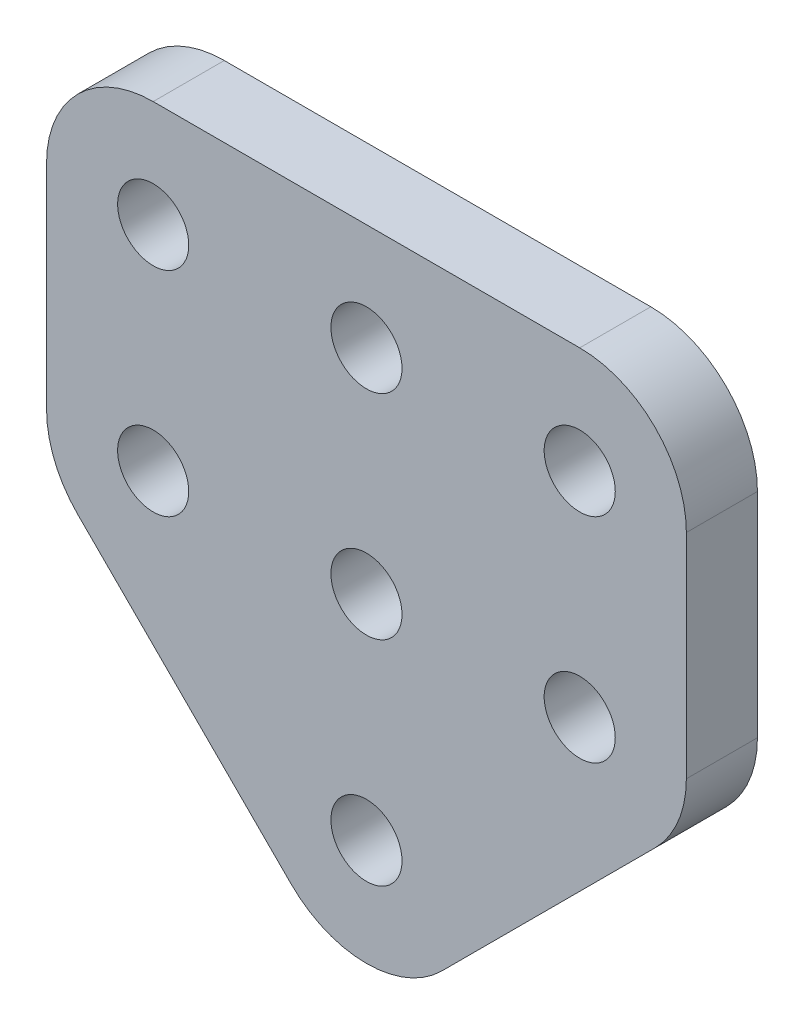
ISO-10303-21;
HEADER;
FILE_DESCRIPTION(('STEP AP214'),'2;1');
FILE_NAME('part.step','',(''),(''),'','','');
FILE_SCHEMA(('AUTOMOTIVE_DESIGN { 1 0 10303 214 1 1 1 1 }'));
ENDSEC;
DATA;
#1=APPLICATION_CONTEXT('core data for automotive mechanical design processes');
#2=APPLICATION_PROTOCOL_DEFINITION('international standard','automotive_design',2000,#1);
#3=PRODUCT_CONTEXT('',#1,'mechanical');
#4=PRODUCT('Part','Part','',(#3));
#5=PRODUCT_RELATED_PRODUCT_CATEGORY('part','',(#4));
#6=PRODUCT_DEFINITION_FORMATION('','',#4);
#7=PRODUCT_DEFINITION_CONTEXT('part definition',#1,'design');
#8=PRODUCT_DEFINITION('design','',#6,#7);
#9=PRODUCT_DEFINITION_SHAPE('','',#8);
#10=(LENGTH_UNIT() NAMED_UNIT(*) SI_UNIT(.MILLI.,.METRE.));
#11=(NAMED_UNIT(*) PLANE_ANGLE_UNIT() SI_UNIT($,.RADIAN.));
#12=(NAMED_UNIT(*) SI_UNIT($,.STERADIAN.) SOLID_ANGLE_UNIT());
#13=UNCERTAINTY_MEASURE_WITH_UNIT(LENGTH_MEASURE(1.E-05),#10,'distance_accuracy_value','');
#14=(GEOMETRIC_REPRESENTATION_CONTEXT(3) GLOBAL_UNCERTAINTY_ASSIGNED_CONTEXT((#13)) GLOBAL_UNIT_ASSIGNED_CONTEXT((#10,
#11,#12)) REPRESENTATION_CONTEXT('',''));
#15=CARTESIAN_POINT('',(0.,0.,0.));
#16=DIRECTION('',(0.,0.,1.));
#17=DIRECTION('',(1.,0.,0.));
#18=AXIS2_PLACEMENT_3D('',#15,#16,#17);
#19=CARTESIAN_POINT('',(187.7270545748,195.1787200631,3.));
#20=DIRECTION('',(0.,0.,1.));
#21=DIRECTION('',(1.,0.,0.));
#22=AXIS2_PLACEMENT_3D('',#19,#20,#21);
#23=PLANE('',#22);
#24=CARTESIAN_POINT('',(187.7270545748,195.1787200631,3.));
#25=DIRECTION('',(0.,0.,1.));
#26=DIRECTION('',(1.,0.,0.));
#27=AXIS2_PLACEMENT_3D('',#24,#25,#26);
#28=CIRCLE('',#27,1.5);
#29=CARTESIAN_POINT('',(189.2270545748,195.1787200631,3.));
#30=VERTEX_POINT('',#29);
#31=EDGE_CURVE('E236',#30,#30,#28,.T.);
#32=ORIENTED_EDGE('',*,*,#31,.F.);
#33=EDGE_LOOP('',(#32));
#34=FACE_BOUND('',#33,.T.);
#35=CARTESIAN_POINT('',(178.7270545748,213.1787200631,3.));
#36=DIRECTION('',(0.,0.,1.));
#37=DIRECTION('',(1.,0.,0.));
#38=AXIS2_PLACEMENT_3D('',#35,#36,#37);
#39=CIRCLE('',#38,1.5);
#40=CARTESIAN_POINT('',(180.2270545748,213.1787200631,3.));
#41=VERTEX_POINT('',#40);
#42=EDGE_CURVE('E224',#41,#41,#39,.T.);
#43=ORIENTED_EDGE('',*,*,#42,.F.);
#44=EDGE_LOOP('',(#43));
#45=FACE_BOUND('',#44,.T.);
#46=CARTESIAN_POINT('',(178.7270545748,204.1787200631,3.));
#47=DIRECTION('',(0.,0.,1.));
#48=DIRECTION('',(1.,0.,0.));
#49=AXIS2_PLACEMENT_3D('',#46,#47,#48);
#50=CIRCLE('',#49,1.5);
#51=CARTESIAN_POINT('',(180.2270545748,204.1787200631,3.));
#52=VERTEX_POINT('',#51);
#53=EDGE_CURVE('E212',#52,#52,#50,.T.);
#54=ORIENTED_EDGE('',*,*,#53,.F.);
#55=EDGE_LOOP('',(#54));
#56=FACE_BOUND('',#55,.T.);
#57=CARTESIAN_POINT('',(187.7270545748,195.1787200631,3.));
#58=DIRECTION('',(0.,0.,1.));
#59=DIRECTION('',(1.,0.,0.));
#60=AXIS2_PLACEMENT_3D('',#57,#58,#59);
#61=CIRCLE('',#60,4.50000000005025);
#62=CARTESIAN_POINT('',(184.5450740594,191.9967395477,3.));
#63=VERTEX_POINT('',#62);
#64=CARTESIAN_POINT('',(190.9090350901,191.9967395477,3.));
#65=VERTEX_POINT('',#64);
#66=EDGE_CURVE('E161',#63,#65,#61,.T.);
#67=ORIENTED_EDGE('',*,*,#66,.T.);
#68=DIRECTION('',(0.707106781186548,0.707106781186548,0.));
#69=VECTOR('',#68,1.);
#70=CARTESIAN_POINT('',(190.9090350901,191.9967395477,3.));
#71=LINE('',#70,#69);
#72=CARTESIAN_POINT('',(199.909035090095,200.996739547705,3.));
#73=VERTEX_POINT('',#72);
#74=EDGE_CURVE('E99',#65,#73,#71,.T.);
#75=ORIENTED_EDGE('',*,*,#74,.T.);
#76=CARTESIAN_POINT('',(196.7270545748,204.1787200631,3.));
#77=DIRECTION('',(0.,0.,1.));
#78=DIRECTION('',(1.,0.,0.));
#79=AXIS2_PLACEMENT_3D('',#76,#77,#78);
#80=CIRCLE('',#79,4.50000000000745);
#81=CARTESIAN_POINT('',(201.2270545748,204.1787200631,3.));
#82=VERTEX_POINT('',#81);
#83=EDGE_CURVE('E182',#73,#82,#80,.T.);
#84=ORIENTED_EDGE('',*,*,#83,.T.);
#85=DIRECTION('',(0.,1.,0.));
#86=VECTOR('',#85,1.);
#87=CARTESIAN_POINT('',(201.2270545748,213.1787200631,3.));
#88=LINE('',#87,#86);
#89=CARTESIAN_POINT('',(201.2270545748,213.1787200631,3.));
#90=VERTEX_POINT('',#89);
#91=EDGE_CURVE('E201',#82,#90,#88,.T.);
#92=ORIENTED_EDGE('',*,*,#91,.T.);
#93=CARTESIAN_POINT('',(196.7270545748,213.1787200631,3.));
#94=DIRECTION('',(0.,0.,1.));
#95=DIRECTION('',(1.,0.,0.));
#96=AXIS2_PLACEMENT_3D('',#93,#94,#95);
#97=CIRCLE('',#96,4.5);
#98=CARTESIAN_POINT('',(196.7270545748,217.6787200631,3.));
#99=VERTEX_POINT('',#98);
#100=EDGE_CURVE('E198',#90,#99,#97,.T.);
#101=ORIENTED_EDGE('',*,*,#100,.T.);
#102=DIRECTION('',(-1.,0.,0.));
#103=VECTOR('',#102,1.);
#104=CARTESIAN_POINT('',(196.7270545748,217.6787200631,3.));
#105=LINE('',#104,#103);
#106=CARTESIAN_POINT('',(178.7270545748,217.6787200631,3.));
#107=VERTEX_POINT('',#106);
#108=EDGE_CURVE('E200',#99,#107,#105,.T.);
#109=ORIENTED_EDGE('',*,*,#108,.T.);
#110=CARTESIAN_POINT('',(178.7270545748,213.1787200631,3.));
#111=DIRECTION('',(0.,0.,1.));
#112=DIRECTION('',(1.,0.,0.));
#113=AXIS2_PLACEMENT_3D('',#110,#111,#112);
#114=CIRCLE('',#113,4.5);
#115=CARTESIAN_POINT('',(174.2270545748,213.1787200631,3.));
#116=VERTEX_POINT('',#115);
#117=EDGE_CURVE('E124',#107,#116,#114,.T.);
#118=ORIENTED_EDGE('',*,*,#117,.T.);
#119=DIRECTION('',(0.,-1.,0.));
#120=VECTOR('',#119,1.);
#121=CARTESIAN_POINT('',(174.2270545748,213.1787200631,3.));
#122=LINE('',#121,#120);
#123=CARTESIAN_POINT('',(174.227054574757,204.1787200631,3.));
#124=VERTEX_POINT('',#123);
#125=EDGE_CURVE('E118',#116,#124,#122,.T.);
#126=ORIENTED_EDGE('',*,*,#125,.T.);
#127=CARTESIAN_POINT('',(178.7270545748,204.1787200631,3.));
#128=DIRECTION('',(0.,0.,1.));
#129=DIRECTION('',(1.,0.,0.));
#130=AXIS2_PLACEMENT_3D('',#127,#128,#129);
#131=CIRCLE('',#130,4.50000000004281);
#132=CARTESIAN_POINT('',(175.5450740594,200.9967395477,3.));
#133=VERTEX_POINT('',#132);
#134=EDGE_CURVE('E122',#124,#133,#131,.T.);
#135=ORIENTED_EDGE('',*,*,#134,.T.);
#136=DIRECTION('',(0.707106781186548,-0.707106781186548,0.));
#137=VECTOR('',#136,1.);
#138=CARTESIAN_POINT('',(184.5450740594,191.9967395477,3.));
#139=LINE('',#138,#137);
#140=EDGE_CURVE('E50',#133,#63,#139,.T.);
#141=ORIENTED_EDGE('',*,*,#140,.T.);
#142=EDGE_LOOP('',(#67,#75,#84,#92,#101,#109,#118,#126,#135,#141));
#143=FACE_BOUND('',#142,.T.);
#144=CARTESIAN_POINT('',(187.7270545748,204.1787200631,3.));
#145=DIRECTION('',(0.,0.,1.));
#146=DIRECTION('',(1.,0.,0.));
#147=AXIS2_PLACEMENT_3D('',#144,#145,#146);
#148=CIRCLE('',#147,1.5);
#149=CARTESIAN_POINT('',(189.2270545748,204.1787200631,3.));
#150=VERTEX_POINT('',#149);
#151=EDGE_CURVE('E146',#150,#150,#148,.T.);
#152=ORIENTED_EDGE('',*,*,#151,.F.);
#153=EDGE_LOOP('',(#152));
#154=FACE_BOUND('',#153,.T.);
#155=CARTESIAN_POINT('',(187.7270545748,213.1787200631,3.));
#156=DIRECTION('',(0.,0.,1.));
#157=DIRECTION('',(1.,0.,0.));
#158=AXIS2_PLACEMENT_3D('',#155,#156,#157);
#159=CIRCLE('',#158,1.5);
#160=CARTESIAN_POINT('',(189.2270545748,213.1787200631,3.));
#161=VERTEX_POINT('',#160);
#162=EDGE_CURVE('E218',#161,#161,#159,.T.);
#163=ORIENTED_EDGE('',*,*,#162,.F.);
#164=EDGE_LOOP('',(#163));
#165=FACE_BOUND('',#164,.T.);
#166=CARTESIAN_POINT('',(196.7270545748,213.1787200631,3.));
#167=DIRECTION('',(0.,0.,1.));
#168=DIRECTION('',(1.,0.,0.));
#169=AXIS2_PLACEMENT_3D('',#166,#167,#168);
#170=CIRCLE('',#169,1.5);
#171=CARTESIAN_POINT('',(198.2270545748,213.1787200631,3.));
#172=VERTEX_POINT('',#171);
#173=EDGE_CURVE('E230',#172,#172,#170,.T.);
#174=ORIENTED_EDGE('',*,*,#173,.F.);
#175=EDGE_LOOP('',(#174));
#176=FACE_BOUND('',#175,.T.);
#177=CARTESIAN_POINT('',(196.7270545748,204.1787200631,3.));
#178=DIRECTION('',(0.,0.,1.));
#179=DIRECTION('',(1.,0.,0.));
#180=AXIS2_PLACEMENT_3D('',#177,#178,#179);
#181=CIRCLE('',#180,1.5);
#182=CARTESIAN_POINT('',(198.2270545748,204.1787200631,3.));
#183=VERTEX_POINT('',#182);
#184=EDGE_CURVE('E242',#183,#183,#181,.T.);
#185=ORIENTED_EDGE('',*,*,#184,.F.);
#186=EDGE_LOOP('',(#185));
#187=FACE_BOUND('',#186,.T.);
#188=ADVANCED_FACE('F33',(#34,#45,#56,#143,#154,#165,#176,#187),#23,.T.);
#189=CARTESIAN_POINT('',(187.7270545748,195.1787200631,0.));
#190=DIRECTION('',(0.,0.,1.));
#191=DIRECTION('',(1.,0.,0.));
#192=AXIS2_PLACEMENT_3D('',#189,#190,#191);
#193=PLANE('',#192);
#194=CARTESIAN_POINT('',(187.7270545748,195.1787200631,0.));
#195=DIRECTION('',(0.,0.,1.));
#196=DIRECTION('',(1.,0.,0.));
#197=AXIS2_PLACEMENT_3D('',#194,#195,#196);
#198=CIRCLE('',#197,1.5);
#199=CARTESIAN_POINT('',(189.2270545748,195.1787200631,0.));
#200=VERTEX_POINT('',#199);
#201=EDGE_CURVE('E239',#200,#200,#198,.T.);
#202=ORIENTED_EDGE('',*,*,#201,.T.);
#203=EDGE_LOOP('',(#202));
#204=FACE_BOUND('',#203,.T.);
#205=CARTESIAN_POINT('',(178.7270545748,213.1787200631,0.));
#206=DIRECTION('',(0.,0.,1.));
#207=DIRECTION('',(1.,0.,0.));
#208=AXIS2_PLACEMENT_3D('',#205,#206,#207);
#209=CIRCLE('',#208,1.5);
#210=CARTESIAN_POINT('',(180.2270545748,213.1787200631,0.));
#211=VERTEX_POINT('',#210);
#212=EDGE_CURVE('E227',#211,#211,#209,.T.);
#213=ORIENTED_EDGE('',*,*,#212,.T.);
#214=EDGE_LOOP('',(#213));
#215=FACE_BOUND('',#214,.T.);
#216=CARTESIAN_POINT('',(178.7270545748,204.1787200631,0.));
#217=DIRECTION('',(0.,0.,1.));
#218=DIRECTION('',(1.,0.,0.));
#219=AXIS2_PLACEMENT_3D('',#216,#217,#218);
#220=CIRCLE('',#219,1.5);
#221=CARTESIAN_POINT('',(180.2270545748,204.1787200631,0.));
#222=VERTEX_POINT('',#221);
#223=EDGE_CURVE('E215',#222,#222,#220,.T.);
#224=ORIENTED_EDGE('',*,*,#223,.T.);
#225=EDGE_LOOP('',(#224));
#226=FACE_BOUND('',#225,.T.);
#227=CARTESIAN_POINT('',(187.7270545748,195.1787200631,0.));
#228=DIRECTION('',(0.,0.,1.));
#229=DIRECTION('',(1.,0.,0.));
#230=AXIS2_PLACEMENT_3D('',#227,#228,#229);
#231=CIRCLE('',#230,4.50000000005025);
#232=CARTESIAN_POINT('',(184.5450740594,191.9967395477,0.));
#233=VERTEX_POINT('',#232);
#234=CARTESIAN_POINT('',(190.9090350901,191.9967395477,0.));
#235=VERTEX_POINT('',#234);
#236=EDGE_CURVE('E142',#233,#235,#231,.T.);
#237=ORIENTED_EDGE('',*,*,#236,.F.);
#238=DIRECTION('',(0.707106781186548,-0.707106781186548,0.));
#239=VECTOR('',#238,1.);
#240=CARTESIAN_POINT('',(184.5450740594,191.9967395477,0.));
#241=LINE('',#240,#239);
#242=CARTESIAN_POINT('',(175.5450740594,200.9967395477,0.));
#243=VERTEX_POINT('',#242);
#244=EDGE_CURVE('E91',#243,#233,#241,.T.);
#245=ORIENTED_EDGE('',*,*,#244,.F.);
#246=CARTESIAN_POINT('',(178.7270545748,204.1787200631,0.));
#247=DIRECTION('',(0.,0.,1.));
#248=DIRECTION('',(1.,0.,0.));
#249=AXIS2_PLACEMENT_3D('',#246,#247,#248);
#250=CIRCLE('',#249,4.50000000004281);
#251=CARTESIAN_POINT('',(174.227054574757,204.1787200631,0.));
#252=VERTEX_POINT('',#251);
#253=EDGE_CURVE('E85',#252,#243,#250,.T.);
#254=ORIENTED_EDGE('',*,*,#253,.F.);
#255=DIRECTION('',(0.,-1.,0.));
#256=VECTOR('',#255,1.);
#257=CARTESIAN_POINT('',(174.2270545748,213.1787200631,0.));
#258=LINE('',#257,#256);
#259=CARTESIAN_POINT('',(174.2270545748,213.1787200631,0.));
#260=VERTEX_POINT('',#259);
#261=EDGE_CURVE('E132',#260,#252,#258,.T.);
#262=ORIENTED_EDGE('',*,*,#261,.F.);
#263=CARTESIAN_POINT('',(178.7270545748,213.1787200631,0.));
#264=DIRECTION('',(0.,0.,1.));
#265=DIRECTION('',(1.,0.,0.));
#266=AXIS2_PLACEMENT_3D('',#263,#264,#265);
#267=CIRCLE('',#266,4.5);
#268=CARTESIAN_POINT('',(178.7270545748,217.6787200631,0.));
#269=VERTEX_POINT('',#268);
#270=EDGE_CURVE('E156',#269,#260,#267,.T.);
#271=ORIENTED_EDGE('',*,*,#270,.F.);
#272=DIRECTION('',(-1.,0.,0.));
#273=VECTOR('',#272,1.);
#274=CARTESIAN_POINT('',(196.7270545748,217.6787200631,0.));
#275=LINE('',#274,#273);
#276=CARTESIAN_POINT('',(196.7270545748,217.6787200631,0.));
#277=VERTEX_POINT('',#276);
#278=EDGE_CURVE('E154',#277,#269,#275,.T.);
#279=ORIENTED_EDGE('',*,*,#278,.F.);
#280=CARTESIAN_POINT('',(196.7270545748,213.1787200631,0.));
#281=DIRECTION('',(0.,0.,1.));
#282=DIRECTION('',(1.,0.,0.));
#283=AXIS2_PLACEMENT_3D('',#280,#281,#282);
#284=CIRCLE('',#283,4.5);
#285=CARTESIAN_POINT('',(201.2270545748,213.1787200631,0.));
#286=VERTEX_POINT('',#285);
#287=EDGE_CURVE('E152',#286,#277,#284,.T.);
#288=ORIENTED_EDGE('',*,*,#287,.F.);
#289=DIRECTION('',(0.,1.,0.));
#290=VECTOR('',#289,1.);
#291=CARTESIAN_POINT('',(201.2270545748,213.1787200631,0.));
#292=LINE('',#291,#290);
#293=CARTESIAN_POINT('',(201.2270545748,204.1787200631,0.));
#294=VERTEX_POINT('',#293);
#295=EDGE_CURVE('E150',#294,#286,#292,.T.);
#296=ORIENTED_EDGE('',*,*,#295,.F.);
#297=CARTESIAN_POINT('',(196.7270545748,204.1787200631,0.));
#298=DIRECTION('',(0.,0.,1.));
#299=DIRECTION('',(1.,0.,0.));
#300=AXIS2_PLACEMENT_3D('',#297,#298,#299);
#301=CIRCLE('',#300,4.50000000000745);
#302=CARTESIAN_POINT('',(199.909035090095,200.996739547705,0.));
#303=VERTEX_POINT('',#302);
#304=EDGE_CURVE('E148',#303,#294,#301,.T.);
#305=ORIENTED_EDGE('',*,*,#304,.F.);
#306=DIRECTION('',(0.707106781186548,0.707106781186548,0.));
#307=VECTOR('',#306,1.);
#308=CARTESIAN_POINT('',(190.9090350901,191.9967395477,0.));
#309=LINE('',#308,#307);
#310=EDGE_CURVE('E145',#235,#303,#309,.T.);
#311=ORIENTED_EDGE('',*,*,#310,.F.);
#312=EDGE_LOOP('',(#237,#245,#254,#262,#271,#279,#288,#296,#305,#311));
#313=FACE_BOUND('',#312,.T.);
#314=CARTESIAN_POINT('',(187.7270545748,204.1787200631,0.));
#315=DIRECTION('',(0.,0.,1.));
#316=DIRECTION('',(1.,0.,0.));
#317=AXIS2_PLACEMENT_3D('',#314,#315,#316);
#318=CIRCLE('',#317,1.5);
#319=CARTESIAN_POINT('',(189.2270545748,204.1787200631,0.));
#320=VERTEX_POINT('',#319);
#321=EDGE_CURVE('E209',#320,#320,#318,.T.);
#322=ORIENTED_EDGE('',*,*,#321,.T.);
#323=EDGE_LOOP('',(#322));
#324=FACE_BOUND('',#323,.T.);
#325=CARTESIAN_POINT('',(187.7270545748,213.1787200631,0.));
#326=DIRECTION('',(0.,0.,1.));
#327=DIRECTION('',(1.,0.,0.));
#328=AXIS2_PLACEMENT_3D('',#325,#326,#327);
#329=CIRCLE('',#328,1.5);
#330=CARTESIAN_POINT('',(189.2270545748,213.1787200631,0.));
#331=VERTEX_POINT('',#330);
#332=EDGE_CURVE('E221',#331,#331,#329,.T.);
#333=ORIENTED_EDGE('',*,*,#332,.T.);
#334=EDGE_LOOP('',(#333));
#335=FACE_BOUND('',#334,.T.);
#336=CARTESIAN_POINT('',(196.7270545748,213.1787200631,0.));
#337=DIRECTION('',(0.,0.,1.));
#338=DIRECTION('',(1.,0.,0.));
#339=AXIS2_PLACEMENT_3D('',#336,#337,#338);
#340=CIRCLE('',#339,1.5);
#341=CARTESIAN_POINT('',(198.2270545748,213.1787200631,0.));
#342=VERTEX_POINT('',#341);
#343=EDGE_CURVE('E233',#342,#342,#340,.T.);
#344=ORIENTED_EDGE('',*,*,#343,.T.);
#345=EDGE_LOOP('',(#344));
#346=FACE_BOUND('',#345,.T.);
#347=CARTESIAN_POINT('',(196.7270545748,204.1787200631,0.));
#348=DIRECTION('',(0.,0.,1.));
#349=DIRECTION('',(1.,0.,0.));
#350=AXIS2_PLACEMENT_3D('',#347,#348,#349);
#351=CIRCLE('',#350,1.5);
#352=CARTESIAN_POINT('',(198.2270545748,204.1787200631,0.));
#353=VERTEX_POINT('',#352);
#354=EDGE_CURVE('E245',#353,#353,#351,.T.);
#355=ORIENTED_EDGE('',*,*,#354,.T.);
#356=EDGE_LOOP('',(#355));
#357=FACE_BOUND('',#356,.T.);
#358=ADVANCED_FACE('F186',(#204,#215,#226,#313,#324,#335,#346,#357),#193,.F.);
#359=CARTESIAN_POINT('',(187.7270545748,195.1787200631,3.));
#360=DIRECTION('',(0.,0.,-1.));
#361=DIRECTION('',(-1.,0.,0.));
#362=AXIS2_PLACEMENT_3D('',#359,#360,#361);
#363=CYLINDRICAL_SURFACE('',#362,4.50000000005025);
#364=ORIENTED_EDGE('',*,*,#236,.T.);
#365=DIRECTION('',(0.,0.,-1.));
#366=VECTOR('',#365,1.);
#367=CARTESIAN_POINT('',(190.9090350901,191.9967395477,3.));
#368=LINE('',#367,#366);
#369=EDGE_CURVE('E11',#65,#235,#368,.T.);
#370=ORIENTED_EDGE('',*,*,#369,.F.);
#371=ORIENTED_EDGE('',*,*,#66,.F.);
#372=DIRECTION('',(0.,0.,-1.));
#373=VECTOR('',#372,1.);
#374=CARTESIAN_POINT('',(184.5450740594,191.9967395477,3.));
#375=LINE('',#374,#373);
#376=EDGE_CURVE('E138',#63,#233,#375,.T.);
#377=ORIENTED_EDGE('',*,*,#376,.T.);
#378=EDGE_LOOP('',(#364,#370,#371,#377));
#379=FACE_BOUND('',#378,.T.);
#380=ADVANCED_FACE('F35',(#379),#363,.T.);
#381=CARTESIAN_POINT('',(190.9090350901,191.9967395477,3.));
#382=DIRECTION('',(-0.707106781186547,0.707106781186547,0.));
#383=DIRECTION('',(-0.707106781186548,-0.707106781186548,0.));
#384=AXIS2_PLACEMENT_3D('',#381,#382,#383);
#385=PLANE('',#384);
#386=ORIENTED_EDGE('',*,*,#310,.T.);
#387=DIRECTION('',(0.,0.,-1.));
#388=VECTOR('',#387,1.);
#389=CARTESIAN_POINT('',(199.909035090095,200.996739547705,3.));
#390=LINE('',#389,#388);
#391=EDGE_CURVE('E42',#73,#303,#390,.T.);
#392=ORIENTED_EDGE('',*,*,#391,.F.);
#393=ORIENTED_EDGE('',*,*,#74,.F.);
#394=ORIENTED_EDGE('',*,*,#369,.T.);
#395=EDGE_LOOP('',(#386,#392,#393,#394));
#396=FACE_BOUND('',#395,.T.);
#397=ADVANCED_FACE('F288',(#396),#385,.F.);
#398=CARTESIAN_POINT('',(196.7270545748,204.1787200631,3.));
#399=DIRECTION('',(0.,0.,-1.));
#400=DIRECTION('',(-1.,0.,0.));
#401=AXIS2_PLACEMENT_3D('',#398,#399,#400);
#402=CYLINDRICAL_SURFACE('',#401,4.50000000000745);
#403=ORIENTED_EDGE('',*,*,#304,.T.);
#404=DIRECTION('',(0.,0.,-1.));
#405=VECTOR('',#404,1.);
#406=CARTESIAN_POINT('',(201.2270545748,204.1787200631,3.));
#407=LINE('',#406,#405);
#408=EDGE_CURVE('E174',#82,#294,#407,.T.);
#409=ORIENTED_EDGE('',*,*,#408,.F.);
#410=ORIENTED_EDGE('',*,*,#83,.F.);
#411=ORIENTED_EDGE('',*,*,#391,.T.);
#412=EDGE_LOOP('',(#403,#409,#410,#411));
#413=FACE_BOUND('',#412,.T.);
#414=ADVANCED_FACE('F180',(#413),#402,.T.);
#415=CARTESIAN_POINT('',(201.2270545748,213.1787200631,3.));
#416=DIRECTION('',(-1.,0.,0.));
#417=DIRECTION('',(0.,0.,1.));
#418=AXIS2_PLACEMENT_3D('',#415,#416,#417);
#419=PLANE('',#418);
#420=ORIENTED_EDGE('',*,*,#295,.T.);
#421=DIRECTION('',(0.,0.,-1.));
#422=VECTOR('',#421,1.);
#423=CARTESIAN_POINT('',(201.2270545748,213.1787200631,3.));
#424=LINE('',#423,#422);
#425=EDGE_CURVE('E171',#90,#286,#424,.T.);
#426=ORIENTED_EDGE('',*,*,#425,.F.);
#427=ORIENTED_EDGE('',*,*,#91,.F.);
#428=ORIENTED_EDGE('',*,*,#408,.T.);
#429=EDGE_LOOP('',(#420,#426,#427,#428));
#430=FACE_BOUND('',#429,.T.);
#431=ADVANCED_FACE('F192',(#430),#419,.F.);
#432=CARTESIAN_POINT('',(196.7270545748,213.1787200631,3.));
#433=DIRECTION('',(0.,0.,-1.));
#434=DIRECTION('',(-1.,0.,0.));
#435=AXIS2_PLACEMENT_3D('',#432,#433,#434);
#436=CYLINDRICAL_SURFACE('',#435,4.5);
#437=ORIENTED_EDGE('',*,*,#287,.T.);
#438=DIRECTION('',(0.,0.,-1.));
#439=VECTOR('',#438,1.);
#440=CARTESIAN_POINT('',(196.7270545748,217.6787200631,3.));
#441=LINE('',#440,#439);
#442=EDGE_CURVE('E168',#99,#277,#441,.T.);
#443=ORIENTED_EDGE('',*,*,#442,.F.);
#444=ORIENTED_EDGE('',*,*,#100,.F.);
#445=ORIENTED_EDGE('',*,*,#425,.T.);
#446=EDGE_LOOP('',(#437,#443,#444,#445));
#447=FACE_BOUND('',#446,.T.);
#448=ADVANCED_FACE('F196',(#447),#436,.T.);
#449=CARTESIAN_POINT('',(196.7270545748,217.6787200631,3.));
#450=DIRECTION('',(0.,-1.,0.));
#451=DIRECTION('',(0.,0.,-1.));
#452=AXIS2_PLACEMENT_3D('',#449,#450,#451);
#453=PLANE('',#452);
#454=ORIENTED_EDGE('',*,*,#278,.T.);
#455=DIRECTION('',(0.,0.,-1.));
#456=VECTOR('',#455,1.);
#457=CARTESIAN_POINT('',(178.7270545748,217.6787200631,3.));
#458=LINE('',#457,#456);
#459=EDGE_CURVE('E165',#107,#269,#458,.T.);
#460=ORIENTED_EDGE('',*,*,#459,.F.);
#461=ORIENTED_EDGE('',*,*,#108,.F.);
#462=ORIENTED_EDGE('',*,*,#442,.T.);
#463=EDGE_LOOP('',(#454,#460,#461,#462));
#464=FACE_BOUND('',#463,.T.);
#465=ADVANCED_FACE('F278',(#464),#453,.F.);
#466=CARTESIAN_POINT('',(178.7270545748,213.1787200631,3.));
#467=DIRECTION('',(0.,0.,-1.));
#468=DIRECTION('',(-1.,0.,0.));
#469=AXIS2_PLACEMENT_3D('',#466,#467,#468);
#470=CYLINDRICAL_SURFACE('',#469,4.5);
#471=ORIENTED_EDGE('',*,*,#270,.T.);
#472=DIRECTION('',(0.,0.,-1.));
#473=VECTOR('',#472,1.);
#474=CARTESIAN_POINT('',(174.2270545748,213.1787200631,3.));
#475=LINE('',#474,#473);
#476=EDGE_CURVE('E133',#116,#260,#475,.T.);
#477=ORIENTED_EDGE('',*,*,#476,.F.);
#478=ORIENTED_EDGE('',*,*,#117,.F.);
#479=ORIENTED_EDGE('',*,*,#459,.T.);
#480=EDGE_LOOP('',(#471,#477,#478,#479));
#481=FACE_BOUND('',#480,.T.);
#482=ADVANCED_FACE('F275',(#481),#470,.T.);
#483=CARTESIAN_POINT('',(174.2270545748,213.1787200631,3.));
#484=DIRECTION('',(1.,0.,0.));
#485=DIRECTION('',(0.,0.,-1.));
#486=AXIS2_PLACEMENT_3D('',#483,#484,#485);
#487=PLANE('',#486);
#488=ORIENTED_EDGE('',*,*,#261,.T.);
#489=DIRECTION('',(0.,0.,-1.));
#490=VECTOR('',#489,1.);
#491=CARTESIAN_POINT('',(174.227054574757,204.1787200631,3.));
#492=LINE('',#491,#490);
#493=EDGE_CURVE('E129',#124,#252,#492,.T.);
#494=ORIENTED_EDGE('',*,*,#493,.F.);
#495=ORIENTED_EDGE('',*,*,#125,.F.);
#496=ORIENTED_EDGE('',*,*,#476,.T.);
#497=EDGE_LOOP('',(#488,#494,#495,#496));
#498=FACE_BOUND('',#497,.T.);
#499=ADVANCED_FACE('F130',(#498),#487,.F.);
#500=CARTESIAN_POINT('',(178.7270545748,204.1787200631,3.));
#501=DIRECTION('',(0.,0.,-1.));
#502=DIRECTION('',(-1.,0.,0.));
#503=AXIS2_PLACEMENT_3D('',#500,#501,#502);
#504=CYLINDRICAL_SURFACE('',#503,4.50000000004281);
#505=ORIENTED_EDGE('',*,*,#253,.T.);
#506=DIRECTION('',(0.,0.,-1.));
#507=VECTOR('',#506,1.);
#508=CARTESIAN_POINT('',(175.5450740594,200.9967395477,3.));
#509=LINE('',#508,#507);
#510=EDGE_CURVE('E134',#133,#243,#509,.T.);
#511=ORIENTED_EDGE('',*,*,#510,.F.);
#512=ORIENTED_EDGE('',*,*,#134,.F.);
#513=ORIENTED_EDGE('',*,*,#493,.T.);
#514=EDGE_LOOP('',(#505,#511,#512,#513));
#515=FACE_BOUND('',#514,.T.);
#516=ADVANCED_FACE('F136',(#515),#504,.T.);
#517=CARTESIAN_POINT('',(184.5450740594,191.9967395477,3.));
#518=DIRECTION('',(0.707106781186547,0.707106781186547,0.));
#519=DIRECTION('',(-0.707106781186548,0.707106781186548,0.));
#520=AXIS2_PLACEMENT_3D('',#517,#518,#519);
#521=PLANE('',#520);
#522=ORIENTED_EDGE('',*,*,#244,.T.);
#523=ORIENTED_EDGE('',*,*,#376,.F.);
#524=ORIENTED_EDGE('',*,*,#140,.F.);
#525=ORIENTED_EDGE('',*,*,#510,.T.);
#526=EDGE_LOOP('',(#522,#523,#524,#525));
#527=FACE_BOUND('',#526,.T.);
#528=ADVANCED_FACE('F268',(#527),#521,.F.);
#529=CARTESIAN_POINT('',(187.7270545748,204.1787200631,3.));
#530=DIRECTION('',(0.,0.,-1.));
#531=DIRECTION('',(-1.,0.,0.));
#532=AXIS2_PLACEMENT_3D('',#529,#530,#531);
#533=CYLINDRICAL_SURFACE('',#532,1.5);
#534=ORIENTED_EDGE('',*,*,#151,.T.);
#535=EDGE_LOOP('',(#534));
#536=FACE_BOUND('',#535,.T.);
#537=ORIENTED_EDGE('',*,*,#321,.F.);
#538=EDGE_LOOP('',(#537));
#539=FACE_BOUND('',#538,.T.);
#540=ADVANCED_FACE('F265',(#536,#539),#533,.F.);
#541=CARTESIAN_POINT('',(178.7270545748,204.1787200631,3.));
#542=DIRECTION('',(0.,0.,-1.));
#543=DIRECTION('',(-1.,0.,0.));
#544=AXIS2_PLACEMENT_3D('',#541,#542,#543);
#545=CYLINDRICAL_SURFACE('',#544,1.5);
#546=ORIENTED_EDGE('',*,*,#53,.T.);
#547=EDGE_LOOP('',(#546));
#548=FACE_BOUND('',#547,.T.);
#549=ORIENTED_EDGE('',*,*,#223,.F.);
#550=EDGE_LOOP('',(#549));
#551=FACE_BOUND('',#550,.T.);
#552=ADVANCED_FACE('F364',(#548,#551),#545,.F.);
#553=CARTESIAN_POINT('',(187.7270545748,213.1787200631,3.));
#554=DIRECTION('',(0.,0.,-1.));
#555=DIRECTION('',(-1.,0.,0.));
#556=AXIS2_PLACEMENT_3D('',#553,#554,#555);
#557=CYLINDRICAL_SURFACE('',#556,1.5);
#558=ORIENTED_EDGE('',*,*,#162,.T.);
#559=EDGE_LOOP('',(#558));
#560=FACE_BOUND('',#559,.T.);
#561=ORIENTED_EDGE('',*,*,#332,.F.);
#562=EDGE_LOOP('',(#561));
#563=FACE_BOUND('',#562,.T.);
#564=ADVANCED_FACE('F372',(#560,#563),#557,.F.);
#565=CARTESIAN_POINT('',(178.7270545748,213.1787200631,3.));
#566=DIRECTION('',(0.,0.,-1.));
#567=DIRECTION('',(-1.,0.,0.));
#568=AXIS2_PLACEMENT_3D('',#565,#566,#567);
#569=CYLINDRICAL_SURFACE('',#568,1.5);
#570=ORIENTED_EDGE('',*,*,#42,.T.);
#571=EDGE_LOOP('',(#570));
#572=FACE_BOUND('',#571,.T.);
#573=ORIENTED_EDGE('',*,*,#212,.F.);
#574=EDGE_LOOP('',(#573));
#575=FACE_BOUND('',#574,.T.);
#576=ADVANCED_FACE('F380',(#572,#575),#569,.F.);
#577=CARTESIAN_POINT('',(196.7270545748,213.1787200631,3.));
#578=DIRECTION('',(0.,0.,-1.));
#579=DIRECTION('',(-1.,0.,0.));
#580=AXIS2_PLACEMENT_3D('',#577,#578,#579);
#581=CYLINDRICAL_SURFACE('',#580,1.5);
#582=ORIENTED_EDGE('',*,*,#173,.T.);
#583=EDGE_LOOP('',(#582));
#584=FACE_BOUND('',#583,.T.);
#585=ORIENTED_EDGE('',*,*,#343,.F.);
#586=EDGE_LOOP('',(#585));
#587=FACE_BOUND('',#586,.T.);
#588=ADVANCED_FACE('F389',(#584,#587),#581,.F.);
#589=CARTESIAN_POINT('',(187.7270545748,195.1787200631,3.));
#590=DIRECTION('',(0.,0.,-1.));
#591=DIRECTION('',(-1.,0.,0.));
#592=AXIS2_PLACEMENT_3D('',#589,#590,#591);
#593=CYLINDRICAL_SURFACE('',#592,1.5);
#594=ORIENTED_EDGE('',*,*,#31,.T.);
#595=EDGE_LOOP('',(#594));
#596=FACE_BOUND('',#595,.T.);
#597=ORIENTED_EDGE('',*,*,#201,.F.);
#598=EDGE_LOOP('',(#597));
#599=FACE_BOUND('',#598,.T.);
#600=ADVANCED_FACE('F398',(#596,#599),#593,.F.);
#601=CARTESIAN_POINT('',(196.7270545748,204.1787200631,3.));
#602=DIRECTION('',(0.,0.,-1.));
#603=DIRECTION('',(-1.,0.,0.));
#604=AXIS2_PLACEMENT_3D('',#601,#602,#603);
#605=CYLINDRICAL_SURFACE('',#604,1.5);
#606=ORIENTED_EDGE('',*,*,#184,.T.);
#607=EDGE_LOOP('',(#606));
#608=FACE_BOUND('',#607,.T.);
#609=ORIENTED_EDGE('',*,*,#354,.F.);
#610=EDGE_LOOP('',(#609));
#611=FACE_BOUND('',#610,.T.);
#612=ADVANCED_FACE('F251',(#608,#611),#605,.F.);
#613=CLOSED_SHELL('',(#188,#358,#380,#397,#414,#431,#448,#465,#482,#499,#516,#528,#540,#552,
#564,#576,#588,#600,#612));
#614=MANIFOLD_SOLID_BREP('B2',#613);
#615=ADVANCED_BREP_SHAPE_REPRESENTATION('',(#18,#614),#14);
#616=SHAPE_DEFINITION_REPRESENTATION(#9,#615);
ENDSEC;
END-ISO-10303-21;
